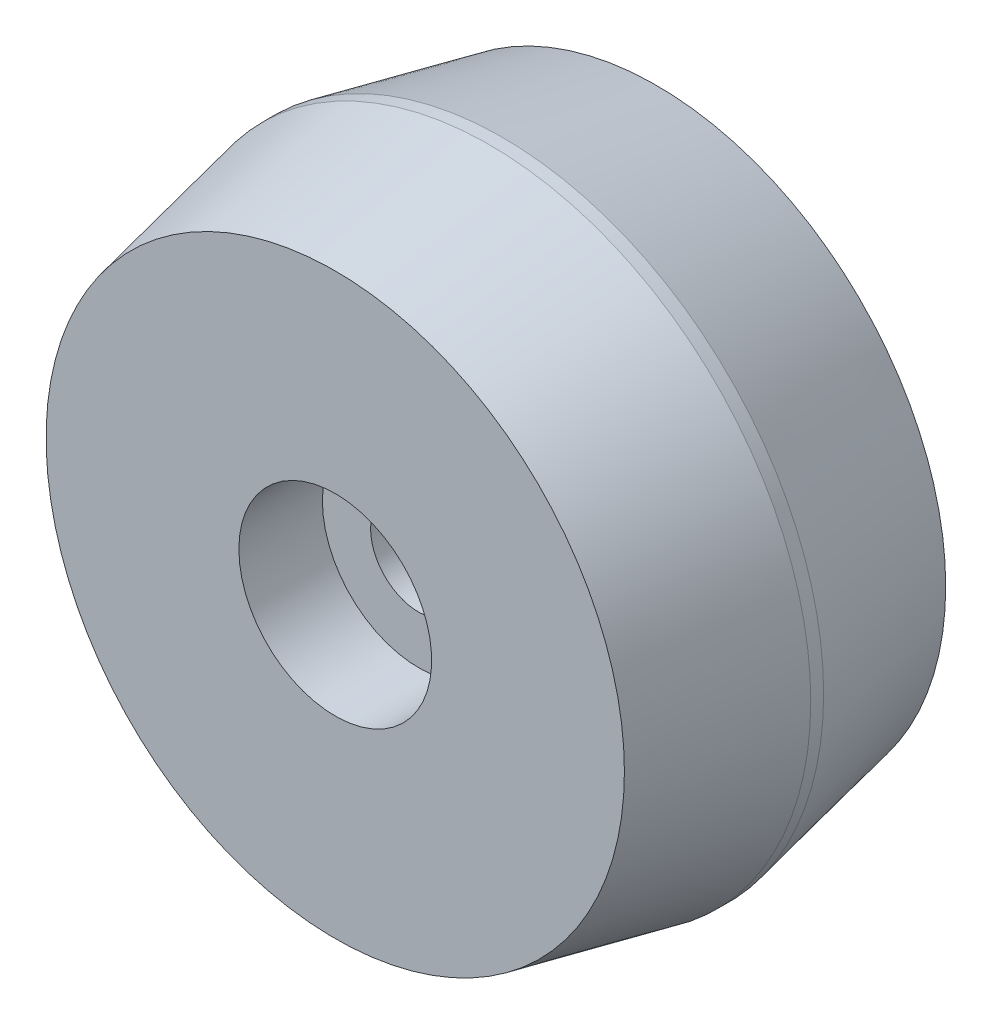
ISO-10303-21;
HEADER;
FILE_DESCRIPTION(('STEP AP214'),'2;1');
FILE_NAME('part.step','',(''),(''),'','','');
FILE_SCHEMA(('AUTOMOTIVE_DESIGN { 1 0 10303 214 1 1 1 1 }'));
ENDSEC;
DATA;
#1=APPLICATION_CONTEXT('core data for automotive mechanical design processes');
#2=APPLICATION_PROTOCOL_DEFINITION('international standard','automotive_design',2000,#1);
#3=PRODUCT_CONTEXT('',#1,'mechanical');
#4=PRODUCT('Part','Part','',(#3));
#5=PRODUCT_RELATED_PRODUCT_CATEGORY('part','',(#4));
#6=PRODUCT_DEFINITION_FORMATION('','',#4);
#7=PRODUCT_DEFINITION_CONTEXT('part definition',#1,'design');
#8=PRODUCT_DEFINITION('design','',#6,#7);
#9=PRODUCT_DEFINITION_SHAPE('','',#8);
#10=(LENGTH_UNIT() NAMED_UNIT(*) SI_UNIT(.MILLI.,.METRE.));
#11=(NAMED_UNIT(*) PLANE_ANGLE_UNIT() SI_UNIT($,.RADIAN.));
#12=(NAMED_UNIT(*) SI_UNIT($,.STERADIAN.) SOLID_ANGLE_UNIT());
#13=UNCERTAINTY_MEASURE_WITH_UNIT(LENGTH_MEASURE(1.E-05),#10,'distance_accuracy_value','');
#14=(GEOMETRIC_REPRESENTATION_CONTEXT(3) GLOBAL_UNCERTAINTY_ASSIGNED_CONTEXT((#13)) GLOBAL_UNIT_ASSIGNED_CONTEXT((#10,
#11,#12)) REPRESENTATION_CONTEXT('',''));
#15=CARTESIAN_POINT('',(0.,0.,0.));
#16=DIRECTION('',(0.,0.,1.));
#17=DIRECTION('',(1.,0.,0.));
#18=AXIS2_PLACEMENT_3D('',#15,#16,#17);
#19=CARTESIAN_POINT('',(0.,0.,10.));
#20=DIRECTION('',(0.,0.,-1.));
#21=DIRECTION('',(-1.,0.,0.));
#22=AXIS2_PLACEMENT_3D('',#19,#20,#21);
#23=CYLINDRICAL_SURFACE('',#22,10.);
#24=CARTESIAN_POINT('',(0.,0.,5.1999999999999));
#25=DIRECTION('',(0.,0.,1.));
#26=DIRECTION('',(1.,0.,0.));
#27=AXIS2_PLACEMENT_3D('',#24,#25,#26);
#28=CIRCLE('',#27,10.);
#29=CARTESIAN_POINT('',(10.,0.,5.1999999999999));
#30=VERTEX_POINT('',#29);
#31=EDGE_CURVE('E10',#30,#30,#28,.F.);
#32=ORIENTED_EDGE('',*,*,#31,.T.);
#33=EDGE_LOOP('',(#32));
#34=FACE_BOUND('',#33,.T.);
#35=CARTESIAN_POINT('',(0.,0.,4.80000000000005));
#36=DIRECTION('',(0.,0.,1.));
#37=DIRECTION('',(1.,0.,0.));
#38=AXIS2_PLACEMENT_3D('',#35,#36,#37);
#39=CIRCLE('',#38,10.);
#40=CARTESIAN_POINT('',(10.,0.,4.80000000000005));
#41=VERTEX_POINT('',#40);
#42=EDGE_CURVE('E57',#41,#41,#39,.T.);
#43=ORIENTED_EDGE('',*,*,#42,.T.);
#44=EDGE_LOOP('',(#43));
#45=FACE_BOUND('',#44,.T.);
#46=ADVANCED_FACE('F39',(#34,#45),#23,.T.);
#47=CARTESIAN_POINT('',(0.,0.,10.));
#48=DIRECTION('',(0.,0.,1.));
#49=DIRECTION('',(1.,0.,0.));
#50=AXIS2_PLACEMENT_3D('',#47,#48,#49);
#51=PLANE('',#50);
#52=CARTESIAN_POINT('',(0.,0.,10.));
#53=DIRECTION('',(0.,0.,-1.));
#54=DIRECTION('',(-1.,0.,0.));
#55=AXIS2_PLACEMENT_3D('',#52,#53,#54);
#56=CIRCLE('',#55,3.);
#57=CARTESIAN_POINT('',(-3.,0.,10.));
#58=VERTEX_POINT('',#57);
#59=EDGE_CURVE('E67',#58,#58,#56,.T.);
#60=ORIENTED_EDGE('',*,*,#59,.T.);
#61=EDGE_LOOP('',(#60));
#62=FACE_BOUND('',#61,.T.);
#63=CARTESIAN_POINT('',(0.,0.,10.));
#64=DIRECTION('',(0.,0.,1.));
#65=DIRECTION('',(1.,0.,0.));
#66=AXIS2_PLACEMENT_3D('',#63,#64,#65);
#67=CIRCLE('',#66,9.);
#68=CARTESIAN_POINT('',(9.,0.,10.));
#69=VERTEX_POINT('',#68);
#70=EDGE_CURVE('E48',#69,#69,#67,.T.);
#71=ORIENTED_EDGE('',*,*,#70,.T.);
#72=EDGE_LOOP('',(#71));
#73=FACE_BOUND('',#72,.T.);
#74=ADVANCED_FACE('F91',(#62,#73),#51,.T.);
#75=CARTESIAN_POINT('',(0.,0.,0.));
#76=DIRECTION('',(0.,0.,1.));
#77=DIRECTION('',(1.,0.,0.));
#78=AXIS2_PLACEMENT_3D('',#75,#76,#77);
#79=PLANE('',#78);
#80=CARTESIAN_POINT('',(0.,0.,0.));
#81=DIRECTION('',(0.,0.,-1.));
#82=DIRECTION('',(-1.,0.,0.));
#83=AXIS2_PLACEMENT_3D('',#80,#81,#82);
#84=CIRCLE('',#83,3.);
#85=CARTESIAN_POINT('',(-3.,0.,0.));
#86=VERTEX_POINT('',#85);
#87=EDGE_CURVE('E61',#86,#86,#84,.T.);
#88=ORIENTED_EDGE('',*,*,#87,.F.);
#89=EDGE_LOOP('',(#88));
#90=FACE_BOUND('',#89,.T.);
#91=CARTESIAN_POINT('',(0.,0.,0.));
#92=DIRECTION('',(0.,0.,1.));
#93=DIRECTION('',(1.,0.,0.));
#94=AXIS2_PLACEMENT_3D('',#91,#92,#93);
#95=CIRCLE('',#94,9.00000000000001);
#96=CARTESIAN_POINT('',(9.00000000000001,0.,0.));
#97=VERTEX_POINT('',#96);
#98=EDGE_CURVE('E52',#97,#97,#95,.F.);
#99=ORIENTED_EDGE('',*,*,#98,.T.);
#100=EDGE_LOOP('',(#99));
#101=FACE_BOUND('',#100,.T.);
#102=ADVANCED_FACE('F96',(#90,#101),#79,.F.);
#103=CARTESIAN_POINT('',(0.,0.,4.80000000000005));
#104=DIRECTION('',(0.,0.,1.));
#105=DIRECTION('',(1.,0.,0.));
#106=AXIS2_PLACEMENT_3D('',#103,#104,#105);
#107=CONICAL_SURFACE('',#106,10.,0.205395389189764);
#108=ORIENTED_EDGE('',*,*,#98,.F.);
#109=EDGE_LOOP('',(#108));
#110=FACE_BOUND('',#109,.T.);
#111=ORIENTED_EDGE('',*,*,#42,.F.);
#112=EDGE_LOOP('',(#111));
#113=FACE_BOUND('',#112,.T.);
#114=ADVANCED_FACE('F102',(#110,#113),#107,.T.);
#115=CARTESIAN_POINT('',(0.,0.,10.));
#116=DIRECTION('',(0.,0.,-1.));
#117=DIRECTION('',(-1.,0.,0.));
#118=AXIS2_PLACEMENT_3D('',#115,#116,#117);
#119=CONICAL_SURFACE('',#118,9.,0.205395389189764);
#120=ORIENTED_EDGE('',*,*,#31,.F.);
#121=EDGE_LOOP('',(#120));
#122=FACE_BOUND('',#121,.T.);
#123=ORIENTED_EDGE('',*,*,#70,.F.);
#124=EDGE_LOOP('',(#123));
#125=FACE_BOUND('',#124,.T.);
#126=ADVANCED_FACE('F42',(#122,#125),#119,.T.);
#127=CARTESIAN_POINT('',(0.,0.,2.6));
#128=DIRECTION('',(0.,0.,-1.));
#129=DIRECTION('',(-1.,0.,0.));
#130=AXIS2_PLACEMENT_3D('',#127,#128,#129);
#131=CYLINDRICAL_SURFACE('',#130,3.);
#132=CARTESIAN_POINT('',(0.,0.,2.6));
#133=DIRECTION('',(0.,0.,-1.));
#134=DIRECTION('',(-1.,0.,0.));
#135=AXIS2_PLACEMENT_3D('',#132,#133,#134);
#136=CIRCLE('',#135,3.);
#137=CARTESIAN_POINT('',(-3.,0.,2.6));
#138=VERTEX_POINT('',#137);
#139=EDGE_CURVE('E60',#138,#138,#136,.T.);
#140=ORIENTED_EDGE('',*,*,#139,.F.);
#141=EDGE_LOOP('',(#140));
#142=FACE_BOUND('',#141,.T.);
#143=ORIENTED_EDGE('',*,*,#87,.T.);
#144=EDGE_LOOP('',(#143));
#145=FACE_BOUND('',#144,.T.);
#146=ADVANCED_FACE('F111',(#142,#145),#131,.F.);
#147=CARTESIAN_POINT('',(0.,0.,2.6));
#148=DIRECTION('',(0.,0.,-1.));
#149=DIRECTION('',(-1.,0.,0.));
#150=AXIS2_PLACEMENT_3D('',#147,#148,#149);
#151=PLANE('',#150);
#152=CARTESIAN_POINT('',(0.,0.,2.6));
#153=DIRECTION('',(0.,0.,-1.));
#154=DIRECTION('',(-1.,0.,0.));
#155=AXIS2_PLACEMENT_3D('',#152,#153,#154);
#156=CIRCLE('',#155,1.5);
#157=CARTESIAN_POINT('',(-1.5,0.,2.6));
#158=VERTEX_POINT('',#157);
#159=EDGE_CURVE('E72',#158,#158,#156,.T.);
#160=ORIENTED_EDGE('',*,*,#159,.F.);
#161=EDGE_LOOP('',(#160));
#162=FACE_BOUND('',#161,.T.);
#163=ORIENTED_EDGE('',*,*,#139,.T.);
#164=EDGE_LOOP('',(#163));
#165=FACE_BOUND('',#164,.T.);
#166=ADVANCED_FACE('F123',(#162,#165),#151,.T.);
#167=CARTESIAN_POINT('',(0.,0.,7.4));
#168=DIRECTION('',(0.,0.,1.));
#169=DIRECTION('',(1.,0.,0.));
#170=AXIS2_PLACEMENT_3D('',#167,#168,#169);
#171=CYLINDRICAL_SURFACE('',#170,3.);
#172=CARTESIAN_POINT('',(0.,0.,7.4));
#173=DIRECTION('',(0.,0.,-1.));
#174=DIRECTION('',(-1.,0.,0.));
#175=AXIS2_PLACEMENT_3D('',#172,#173,#174);
#176=CIRCLE('',#175,3.);
#177=CARTESIAN_POINT('',(-3.,0.,7.4));
#178=VERTEX_POINT('',#177);
#179=EDGE_CURVE('E64',#178,#178,#176,.T.);
#180=ORIENTED_EDGE('',*,*,#179,.T.);
#181=EDGE_LOOP('',(#180));
#182=FACE_BOUND('',#181,.T.);
#183=ORIENTED_EDGE('',*,*,#59,.F.);
#184=EDGE_LOOP('',(#183));
#185=FACE_BOUND('',#184,.T.);
#186=ADVANCED_FACE('F88',(#182,#185),#171,.F.);
#187=CARTESIAN_POINT('',(0.,0.,7.4));
#188=DIRECTION('',(0.,0.,-1.));
#189=DIRECTION('',(-1.,0.,0.));
#190=AXIS2_PLACEMENT_3D('',#187,#188,#189);
#191=PLANE('',#190);
#192=CARTESIAN_POINT('',(0.,0.,7.4));
#193=DIRECTION('',(0.,0.,-1.));
#194=DIRECTION('',(-1.,0.,0.));
#195=AXIS2_PLACEMENT_3D('',#192,#193,#194);
#196=CIRCLE('',#195,1.5);
#197=CARTESIAN_POINT('',(-1.5,0.,7.4));
#198=VERTEX_POINT('',#197);
#199=EDGE_CURVE('E44',#198,#198,#196,.T.);
#200=ORIENTED_EDGE('',*,*,#199,.T.);
#201=EDGE_LOOP('',(#200));
#202=FACE_BOUND('',#201,.T.);
#203=ORIENTED_EDGE('',*,*,#179,.F.);
#204=EDGE_LOOP('',(#203));
#205=FACE_BOUND('',#204,.T.);
#206=ADVANCED_FACE('F79',(#202,#205),#191,.F.);
#207=CARTESIAN_POINT('',(0.,0.,10.));
#208=DIRECTION('',(0.,0.,-1.));
#209=DIRECTION('',(-1.,0.,0.));
#210=AXIS2_PLACEMENT_3D('',#207,#208,#209);
#211=CYLINDRICAL_SURFACE('',#210,1.5);
#212=ORIENTED_EDGE('',*,*,#159,.T.);
#213=EDGE_LOOP('',(#212));
#214=FACE_BOUND('',#213,.T.);
#215=ORIENTED_EDGE('',*,*,#199,.F.);
#216=EDGE_LOOP('',(#215));
#217=FACE_BOUND('',#216,.T.);
#218=ADVANCED_FACE('F82',(#214,#217),#211,.F.);
#219=CLOSED_SHELL('',(#46,#74,#102,#114,#126,#146,#166,#186,#206,#218));
#220=MANIFOLD_SOLID_BREP('B2',#219);
#221=ADVANCED_BREP_SHAPE_REPRESENTATION('',(#18,#220),#14);
#222=SHAPE_DEFINITION_REPRESENTATION(#9,#221);
ENDSEC;
END-ISO-10303-21;
